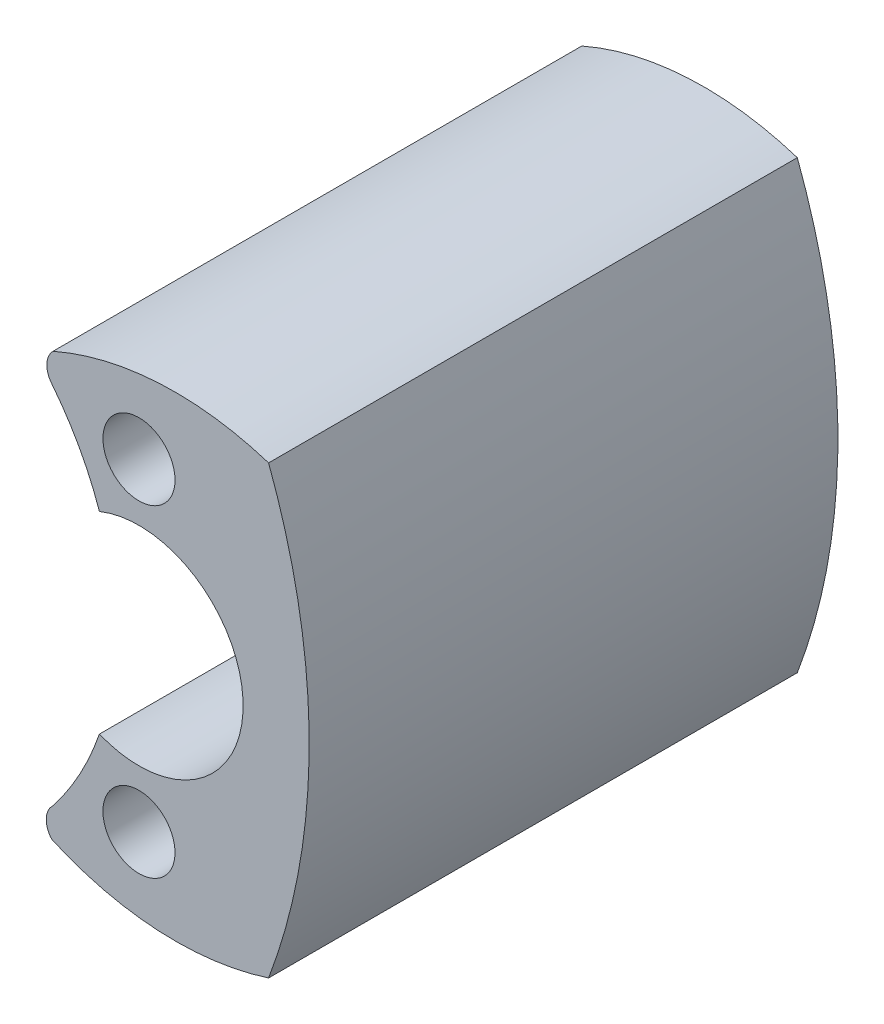
ISO-10303-21;
HEADER;
FILE_DESCRIPTION(('STEP AP214'),'2;1');
FILE_NAME('part.step','',(''),(''),'','','');
FILE_SCHEMA(('AUTOMOTIVE_DESIGN { 1 0 10303 214 1 1 1 1 }'));
ENDSEC;
DATA;
#1=APPLICATION_CONTEXT('core data for automotive mechanical design processes');
#2=APPLICATION_PROTOCOL_DEFINITION('international standard','automotive_design',2000,#1);
#3=PRODUCT_CONTEXT('',#1,'mechanical');
#4=PRODUCT('Part','Part','',(#3));
#5=PRODUCT_RELATED_PRODUCT_CATEGORY('part','',(#4));
#6=PRODUCT_DEFINITION_FORMATION('','',#4);
#7=PRODUCT_DEFINITION_CONTEXT('part definition',#1,'design');
#8=PRODUCT_DEFINITION('design','',#6,#7);
#9=PRODUCT_DEFINITION_SHAPE('','',#8);
#10=(LENGTH_UNIT() NAMED_UNIT(*) SI_UNIT(.MILLI.,.METRE.));
#11=(NAMED_UNIT(*) PLANE_ANGLE_UNIT() SI_UNIT($,.RADIAN.));
#12=(NAMED_UNIT(*) SI_UNIT($,.STERADIAN.) SOLID_ANGLE_UNIT());
#13=UNCERTAINTY_MEASURE_WITH_UNIT(LENGTH_MEASURE(1.E-05),#10,'distance_accuracy_value','');
#14=(GEOMETRIC_REPRESENTATION_CONTEXT(3) GLOBAL_UNCERTAINTY_ASSIGNED_CONTEXT((#13)) GLOBAL_UNIT_ASSIGNED_CONTEXT((#10,
#11,#12)) REPRESENTATION_CONTEXT('',''));
#15=CARTESIAN_POINT('',(0.,0.,0.));
#16=DIRECTION('',(0.,0.,1.));
#17=DIRECTION('',(1.,0.,0.));
#18=AXIS2_PLACEMENT_3D('',#15,#16,#17);
#19=CARTESIAN_POINT('',(-13.2313355478784,0.,22.));
#20=DIRECTION('',(0.,0.,-1.));
#21=DIRECTION('',(-1.,0.,0.));
#22=AXIS2_PLACEMENT_3D('',#19,#20,#21);
#23=CYLINDRICAL_SURFACE('',#22,12.2604861513936);
#24=CARTESIAN_POINT('',(-13.2313355478784,0.,22.));
#25=DIRECTION('',(0.,0.,-1.));
#26=DIRECTION('',(-1.,0.,0.));
#27=AXIS2_PLACEMENT_3D('',#24,#25,#26);
#28=CIRCLE('',#27,12.2604861513936);
#29=CARTESIAN_POINT('',(-1.64537225114125,-4.01060782864323,22.));
#30=VERTEX_POINT('',#29);
#31=CARTESIAN_POINT('',(-3.57576767996249,-7.55576136577806,22.));
#32=VERTEX_POINT('',#31);
#33=EDGE_CURVE('E125',#30,#32,#28,.T.);
#34=ORIENTED_EDGE('',*,*,#33,.F.);
#35=DIRECTION('',(0.,0.,-1.));
#36=VECTOR('',#35,1.);
#37=CARTESIAN_POINT('',(-1.64537225114125,-4.01060782864323,11.999));
#38=LINE('',#37,#36);
#39=CARTESIAN_POINT('',(-1.64537225114125,-4.01060782864323,-0.001));
#40=VERTEX_POINT('',#39);
#41=EDGE_CURVE('E112',#30,#40,#38,.T.);
#42=ORIENTED_EDGE('',*,*,#41,.T.);
#43=CARTESIAN_POINT('',(-13.2313355478784,0.,-0.001));
#44=DIRECTION('',(0.,0.,-1.));
#45=DIRECTION('',(-1.,0.,0.));
#46=AXIS2_PLACEMENT_3D('',#43,#44,#45);
#47=CIRCLE('',#46,12.2604861513936);
#48=CARTESIAN_POINT('',(-3.57576767996249,-7.55576136577806,-0.001));
#49=VERTEX_POINT('',#48);
#50=EDGE_CURVE('E123',#40,#49,#47,.T.);
#51=ORIENTED_EDGE('',*,*,#50,.T.);
#52=DIRECTION('',(0.,0.,-1.));
#53=VECTOR('',#52,1.);
#54=CARTESIAN_POINT('',(-3.57576767996249,-7.55576136577806,22.));
#55=LINE('',#54,#53);
#56=EDGE_CURVE('E167',#32,#49,#55,.T.);
#57=ORIENTED_EDGE('',*,*,#56,.F.);
#58=EDGE_LOOP('',(#34,#42,#51,#57));
#59=FACE_BOUND('',#58,.T.);
#60=ADVANCED_FACE('F47',(#59),#23,.F.);
#61=CARTESIAN_POINT('',(1.51645658150854,-2.74018411875687,22.));
#62=DIRECTION('',(0.,0.,-1.));
#63=DIRECTION('',(-1.,0.,0.));
#64=AXIS2_PLACEMENT_3D('',#61,#62,#63);
#65=CYLINDRICAL_SURFACE('',#64,12.6318125052895);
#66=DIRECTION('',(0.,0.,-1.));
#67=VECTOR('',#66,1.);
#68=CARTESIAN_POINT('',(5.39429470920508,9.28167341758802,22.));
#69=LINE('',#68,#67);
#70=CARTESIAN_POINT('',(5.39429470920508,9.28167341758802,22.));
#71=VERTEX_POINT('',#70);
#72=CARTESIAN_POINT('',(5.39429470920508,9.28167341758802,-0.001));
#73=VERTEX_POINT('',#72);
#74=EDGE_CURVE('E161',#71,#73,#69,.T.);
#75=ORIENTED_EDGE('',*,*,#74,.T.);
#76=CARTESIAN_POINT('',(1.51645658150854,-2.74018411875687,-0.001));
#77=DIRECTION('',(0.,0.,1.));
#78=DIRECTION('',(-1.,0.,0.));
#79=AXIS2_PLACEMENT_3D('',#76,#77,#78);
#80=CIRCLE('',#79,12.6318125052895);
#81=CARTESIAN_POINT('',(-3.57576767996249,8.81974404882597,-0.001));
#82=VERTEX_POINT('',#81);
#83=EDGE_CURVE('E138',#73,#82,#80,.T.);
#84=ORIENTED_EDGE('',*,*,#83,.T.);
#85=DIRECTION('',(0.,0.,-1.));
#86=VECTOR('',#85,1.);
#87=CARTESIAN_POINT('',(-3.57576767996249,8.81974404882597,22.));
#88=LINE('',#87,#86);
#89=CARTESIAN_POINT('',(-3.57576767996249,8.81974404882597,22.));
#90=VERTEX_POINT('',#89);
#91=EDGE_CURVE('E11',#90,#82,#88,.T.);
#92=ORIENTED_EDGE('',*,*,#91,.F.);
#93=CARTESIAN_POINT('',(1.51645658150854,-2.74018411875687,22.));
#94=DIRECTION('',(0.,0.,1.));
#95=DIRECTION('',(-1.,0.,0.));
#96=AXIS2_PLACEMENT_3D('',#93,#94,#95);
#97=CIRCLE('',#96,12.6318125052895);
#98=EDGE_CURVE('E149',#71,#90,#97,.T.);
#99=ORIENTED_EDGE('',*,*,#98,.F.);
#100=EDGE_LOOP('',(#75,#84,#92,#99));
#101=FACE_BOUND('',#100,.T.);
#102=ADVANCED_FACE('F49',(#101),#65,.T.);
#103=CARTESIAN_POINT('',(-2.93942531431104,8.19213389498871,22.));
#104=DIRECTION('',(0.,0.,-1.));
#105=DIRECTION('',(-1.,0.,0.));
#106=AXIS2_PLACEMENT_3D('',#103,#104,#105);
#107=CYLINDRICAL_SURFACE('',#106,0.893770726485547);
#108=ORIENTED_EDGE('',*,*,#91,.T.);
#109=CARTESIAN_POINT('',(-2.93942531431104,8.19213389498871,-0.001));
#110=DIRECTION('',(0.,0.,1.));
#111=DIRECTION('',(-1.,0.,0.));
#112=AXIS2_PLACEMENT_3D('',#109,#110,#111);
#113=CIRCLE('',#112,0.893770726485547);
#114=CARTESIAN_POINT('',(-3.63871286599695,7.63551640372596,-0.001));
#115=VERTEX_POINT('',#114);
#116=EDGE_CURVE('E135',#82,#115,#113,.T.);
#117=ORIENTED_EDGE('',*,*,#116,.T.);
#118=DIRECTION('',(0.,0.,-1.));
#119=VECTOR('',#118,1.);
#120=CARTESIAN_POINT('',(-3.63871286599695,7.63551640372596,22.));
#121=LINE('',#120,#119);
#122=CARTESIAN_POINT('',(-3.63871286599695,7.63551640372596,22.));
#123=VERTEX_POINT('',#122);
#124=EDGE_CURVE('E55',#123,#115,#121,.T.);
#125=ORIENTED_EDGE('',*,*,#124,.F.);
#126=CARTESIAN_POINT('',(-2.93942531431104,8.19213389498871,22.));
#127=DIRECTION('',(0.,0.,1.));
#128=DIRECTION('',(-1.,0.,0.));
#129=AXIS2_PLACEMENT_3D('',#126,#127,#128);
#130=CIRCLE('',#129,0.893770726485547);
#131=EDGE_CURVE('E151',#90,#123,#130,.T.);
#132=ORIENTED_EDGE('',*,*,#131,.F.);
#133=EDGE_LOOP('',(#108,#117,#125,#132));
#134=FACE_BOUND('',#133,.T.);
#135=ADVANCED_FACE('F176',(#134),#107,.T.);
#136=CARTESIAN_POINT('',(-1.64537225114125,4.01060782864323,-0.00100000000000088));
#137=VERTEX_POINT('',#136);
#138=EDGE_CURVE('E134',#115,#137,#47,.T.);
#139=ORIENTED_EDGE('',*,*,#138,.T.);
#140=DIRECTION('',(0.,0.,-1.));
#141=VECTOR('',#140,1.);
#142=CARTESIAN_POINT('',(-1.64537225114125,4.01060782864323,11.999));
#143=LINE('',#142,#141);
#144=CARTESIAN_POINT('',(-1.64537225114125,4.01060782864323,22.));
#145=VERTEX_POINT('',#144);
#146=EDGE_CURVE('E62',#137,#145,#143,.F.);
#147=ORIENTED_EDGE('',*,*,#146,.T.);
#148=EDGE_CURVE('E153',#123,#145,#28,.T.);
#149=ORIENTED_EDGE('',*,*,#148,.F.);
#150=ORIENTED_EDGE('',*,*,#124,.T.);
#151=EDGE_LOOP('',(#139,#147,#149,#150));
#152=FACE_BOUND('',#151,.T.);
#153=ADVANCED_FACE('F171',(#152),#23,.F.);
#154=CARTESIAN_POINT('',(-2.97974763085371,-8.20163469798779,22.));
#155=DIRECTION('',(0.,0.,-1.));
#156=DIRECTION('',(-1.,0.,0.));
#157=AXIS2_PLACEMENT_3D('',#154,#155,#156);
#158=CYLINDRICAL_SURFACE('',#157,0.878858498393984);
#159=ORIENTED_EDGE('',*,*,#56,.T.);
#160=CARTESIAN_POINT('',(-2.97974763085371,-8.20163469798779,-0.001));
#161=DIRECTION('',(0.,0.,1.));
#162=DIRECTION('',(1.,0.,0.));
#163=AXIS2_PLACEMENT_3D('',#160,#161,#162);
#164=CIRCLE('',#163,0.878858498393984);
#165=CARTESIAN_POINT('',(-3.62562096306344,-8.79765474709655,-0.001));
#166=VERTEX_POINT('',#165);
#167=EDGE_CURVE('E133',#49,#166,#164,.T.);
#168=ORIENTED_EDGE('',*,*,#167,.T.);
#169=DIRECTION('',(0.,0.,-1.));
#170=VECTOR('',#169,1.);
#171=CARTESIAN_POINT('',(-3.62562096306344,-8.79765474709655,22.));
#172=LINE('',#171,#170);
#173=CARTESIAN_POINT('',(-3.62562096306344,-8.79765474709655,22.));
#174=VERTEX_POINT('',#173);
#175=EDGE_CURVE('E165',#174,#166,#172,.T.);
#176=ORIENTED_EDGE('',*,*,#175,.F.);
#177=CARTESIAN_POINT('',(-2.97974763085371,-8.20163469798779,22.));
#178=DIRECTION('',(0.,0.,1.));
#179=DIRECTION('',(1.,0.,0.));
#180=AXIS2_PLACEMENT_3D('',#177,#178,#179);
#181=CIRCLE('',#180,0.878858498393984);
#182=EDGE_CURVE('E156',#32,#174,#181,.T.);
#183=ORIENTED_EDGE('',*,*,#182,.F.);
#184=EDGE_LOOP('',(#159,#168,#176,#183));
#185=FACE_BOUND('',#184,.T.);
#186=ADVANCED_FACE('F198',(#185),#158,.T.);
#187=CARTESIAN_POINT('',(1.51645658150854,2.74018411875671,22.));
#188=DIRECTION('',(0.,0.,-1.));
#189=DIRECTION('',(-1.,0.,0.));
#190=AXIS2_PLACEMENT_3D('',#187,#188,#189);
#191=CYLINDRICAL_SURFACE('',#190,12.6318125052894);
#192=ORIENTED_EDGE('',*,*,#175,.T.);
#193=CARTESIAN_POINT('',(1.51645658150854,2.74018411875671,-0.001));
#194=DIRECTION('',(0.,0.,1.));
#195=DIRECTION('',(1.,0.,0.));
#196=AXIS2_PLACEMENT_3D('',#193,#194,#195);
#197=CIRCLE('',#196,12.6318125052894);
#198=CARTESIAN_POINT('',(5.39429470920509,-9.28167341758802,-0.001));
#199=VERTEX_POINT('',#198);
#200=EDGE_CURVE('E143',#166,#199,#197,.T.);
#201=ORIENTED_EDGE('',*,*,#200,.T.);
#202=DIRECTION('',(0.,0.,-1.));
#203=VECTOR('',#202,1.);
#204=CARTESIAN_POINT('',(5.39429470920509,-9.28167341758802,22.));
#205=LINE('',#204,#203);
#206=CARTESIAN_POINT('',(5.39429470920509,-9.28167341758802,22.));
#207=VERTEX_POINT('',#206);
#208=EDGE_CURVE('E163',#207,#199,#205,.T.);
#209=ORIENTED_EDGE('',*,*,#208,.F.);
#210=CARTESIAN_POINT('',(1.51645658150854,2.74018411875671,22.));
#211=DIRECTION('',(0.,0.,1.));
#212=DIRECTION('',(1.,0.,0.));
#213=AXIS2_PLACEMENT_3D('',#210,#211,#212);
#214=CIRCLE('',#213,12.6318125052894);
#215=EDGE_CURVE('E158',#174,#207,#214,.T.);
#216=ORIENTED_EDGE('',*,*,#215,.F.);
#217=EDGE_LOOP('',(#192,#201,#209,#216));
#218=FACE_BOUND('',#217,.T.);
#219=ADVANCED_FACE('F202',(#218),#191,.T.);
#220=CARTESIAN_POINT('',(-19.2656664170293,0.,22.));
#221=DIRECTION('',(0.,0.,-1.));
#222=DIRECTION('',(-1.,0.,0.));
#223=AXIS2_PLACEMENT_3D('',#220,#221,#222);
#224=CYLINDRICAL_SURFACE('',#223,26.3488736794981);
#225=ORIENTED_EDGE('',*,*,#208,.T.);
#226=CARTESIAN_POINT('',(-19.2656664170293,0.,-0.001));
#227=DIRECTION('',(0.,0.,1.));
#228=DIRECTION('',(-1.,0.,0.));
#229=AXIS2_PLACEMENT_3D('',#226,#227,#228);
#230=CIRCLE('',#229,26.3488736794981);
#231=EDGE_CURVE('E146',#199,#73,#230,.T.);
#232=ORIENTED_EDGE('',*,*,#231,.T.);
#233=ORIENTED_EDGE('',*,*,#74,.F.);
#234=CARTESIAN_POINT('',(-19.2656664170293,0.,22.));
#235=DIRECTION('',(0.,0.,1.));
#236=DIRECTION('',(-1.,0.,0.));
#237=AXIS2_PLACEMENT_3D('',#234,#235,#236);
#238=CIRCLE('',#237,26.3488736794981);
#239=EDGE_CURVE('E70',#207,#71,#238,.T.);
#240=ORIENTED_EDGE('',*,*,#239,.F.);
#241=EDGE_LOOP('',(#225,#232,#233,#240));
#242=FACE_BOUND('',#241,.T.);
#243=ADVANCED_FACE('F204',(#242),#224,.T.);
#244=CARTESIAN_POINT('',(-8.87460491776037,-1.37009205937844,22.));
#245=DIRECTION('',(0.,0.,-1.));
#246=DIRECTION('',(-1.,0.,0.));
#247=AXIS2_PLACEMENT_3D('',#244,#245,#246);
#248=PLANE('',#247);
#249=CARTESIAN_POINT('',(0.,-6.715,22.));
#250=DIRECTION('',(0.,0.,1.));
#251=DIRECTION('',(-1.,0.,0.));
#252=AXIS2_PLACEMENT_3D('',#249,#250,#251);
#253=CIRCLE('',#252,1.5);
#254=CARTESIAN_POINT('',(-1.5,-6.715,22.));
#255=VERTEX_POINT('',#254);
#256=EDGE_CURVE('E126',#255,#255,#253,.T.);
#257=ORIENTED_EDGE('',*,*,#256,.F.);
#258=EDGE_LOOP('',(#257));
#259=FACE_BOUND('',#258,.T.);
#260=CARTESIAN_POINT('',(0.,6.715,22.));
#261=DIRECTION('',(0.,0.,1.));
#262=DIRECTION('',(1.,0.,0.));
#263=AXIS2_PLACEMENT_3D('',#260,#261,#262);
#264=CIRCLE('',#263,1.5);
#265=CARTESIAN_POINT('',(1.5,6.715,22.));
#266=VERTEX_POINT('',#265);
#267=EDGE_CURVE('E183',#266,#266,#264,.T.);
#268=ORIENTED_EDGE('',*,*,#267,.F.);
#269=EDGE_LOOP('',(#268));
#270=FACE_BOUND('',#269,.T.);
#271=ORIENTED_EDGE('',*,*,#148,.T.);
#272=CARTESIAN_POINT('',(0.,0.,22.));
#273=DIRECTION('',(0.,0.,-1.));
#274=DIRECTION('',(-1.,0.,0.));
#275=AXIS2_PLACEMENT_3D('',#272,#273,#274);
#276=CIRCLE('',#275,4.335);
#277=EDGE_CURVE('E118',#145,#30,#276,.T.);
#278=ORIENTED_EDGE('',*,*,#277,.T.);
#279=ORIENTED_EDGE('',*,*,#33,.T.);
#280=ORIENTED_EDGE('',*,*,#182,.T.);
#281=ORIENTED_EDGE('',*,*,#215,.T.);
#282=ORIENTED_EDGE('',*,*,#239,.T.);
#283=ORIENTED_EDGE('',*,*,#98,.T.);
#284=ORIENTED_EDGE('',*,*,#131,.T.);
#285=EDGE_LOOP('',(#271,#278,#279,#280,#281,#282,#283,#284));
#286=FACE_BOUND('',#285,.T.);
#287=ADVANCED_FACE('F194',(#259,#270,#286),#248,.F.);
#288=CARTESIAN_POINT('',(-8.87460491776037,-1.37009205937844,-0.001));
#289=DIRECTION('',(0.,0.,-1.));
#290=DIRECTION('',(-1.,0.,0.));
#291=AXIS2_PLACEMENT_3D('',#288,#289,#290);
#292=PLANE('',#291);
#293=CARTESIAN_POINT('',(0.,0.,-0.001));
#294=DIRECTION('',(0.,0.,-1.));
#295=DIRECTION('',(-1.,0.,0.));
#296=AXIS2_PLACEMENT_3D('',#293,#294,#295);
#297=CIRCLE('',#296,4.335);
#298=EDGE_CURVE('E109',#137,#40,#297,.T.);
#299=ORIENTED_EDGE('',*,*,#298,.F.);
#300=ORIENTED_EDGE('',*,*,#138,.F.);
#301=ORIENTED_EDGE('',*,*,#116,.F.);
#302=ORIENTED_EDGE('',*,*,#83,.F.);
#303=ORIENTED_EDGE('',*,*,#231,.F.);
#304=ORIENTED_EDGE('',*,*,#200,.F.);
#305=ORIENTED_EDGE('',*,*,#167,.F.);
#306=ORIENTED_EDGE('',*,*,#50,.F.);
#307=EDGE_LOOP('',(#299,#300,#301,#302,#303,#304,#305,#306));
#308=FACE_BOUND('',#307,.T.);
#309=CARTESIAN_POINT('',(0.,-6.715,-0.001000000000001));
#310=DIRECTION('',(0.,0.,1.));
#311=DIRECTION('',(-1.,0.,0.));
#312=AXIS2_PLACEMENT_3D('',#309,#310,#311);
#313=CIRCLE('',#312,1.5);
#314=CARTESIAN_POINT('',(-1.5,-6.715,-0.001000000000001));
#315=VERTEX_POINT('',#314);
#316=EDGE_CURVE('E187',#315,#315,#313,.T.);
#317=ORIENTED_EDGE('',*,*,#316,.T.);
#318=EDGE_LOOP('',(#317));
#319=FACE_BOUND('',#318,.T.);
#320=CARTESIAN_POINT('',(0.,6.715,-0.001000000000001));
#321=DIRECTION('',(0.,0.,1.));
#322=DIRECTION('',(1.,0.,0.));
#323=AXIS2_PLACEMENT_3D('',#320,#321,#322);
#324=CIRCLE('',#323,1.5);
#325=CARTESIAN_POINT('',(1.5,6.715,-0.001000000000001));
#326=VERTEX_POINT('',#325);
#327=EDGE_CURVE('E181',#326,#326,#324,.T.);
#328=ORIENTED_EDGE('',*,*,#327,.T.);
#329=EDGE_LOOP('',(#328));
#330=FACE_BOUND('',#329,.T.);
#331=ADVANCED_FACE('F129',(#308,#319,#330),#292,.T.);
#332=CARTESIAN_POINT('',(0.,6.715,-0.001000000000001));
#333=DIRECTION('',(0.,0.,1.));
#334=DIRECTION('',(1.,0.,0.));
#335=AXIS2_PLACEMENT_3D('',#332,#333,#334);
#336=CYLINDRICAL_SURFACE('',#335,1.5);
#337=ORIENTED_EDGE('',*,*,#327,.F.);
#338=EDGE_LOOP('',(#337));
#339=FACE_BOUND('',#338,.T.);
#340=ORIENTED_EDGE('',*,*,#267,.T.);
#341=EDGE_LOOP('',(#340));
#342=FACE_BOUND('',#341,.T.);
#343=ADVANCED_FACE('F275',(#339,#342),#336,.F.);
#344=CARTESIAN_POINT('',(0.,-6.715,-0.001000000000001));
#345=DIRECTION('',(0.,0.,1.));
#346=DIRECTION('',(1.,0.,0.));
#347=AXIS2_PLACEMENT_3D('',#344,#345,#346);
#348=CYLINDRICAL_SURFACE('',#347,1.5);
#349=ORIENTED_EDGE('',*,*,#316,.F.);
#350=EDGE_LOOP('',(#349));
#351=FACE_BOUND('',#350,.T.);
#352=ORIENTED_EDGE('',*,*,#256,.T.);
#353=EDGE_LOOP('',(#352));
#354=FACE_BOUND('',#353,.T.);
#355=ADVANCED_FACE('F245',(#351,#354),#348,.F.);
#356=CARTESIAN_POINT('',(0.,0.,23.999));
#357=DIRECTION('',(0.,0.,-1.));
#358=DIRECTION('',(-1.,0.,0.));
#359=AXIS2_PLACEMENT_3D('',#356,#357,#358);
#360=CYLINDRICAL_SURFACE('',#359,4.335);
#361=ORIENTED_EDGE('',*,*,#277,.F.);
#362=ORIENTED_EDGE('',*,*,#146,.F.);
#363=ORIENTED_EDGE('',*,*,#298,.T.);
#364=ORIENTED_EDGE('',*,*,#41,.F.);
#365=EDGE_LOOP('',(#361,#362,#363,#364));
#366=FACE_BOUND('',#365,.T.);
#367=ADVANCED_FACE('F111',(#366),#360,.F.);
#368=CLOSED_SHELL('',(#60,#102,#135,#153,#186,#219,#243,#287,#331,#343,#355,#367));
#369=MANIFOLD_SOLID_BREP('B2',#368);
#370=ADVANCED_BREP_SHAPE_REPRESENTATION('',(#18,#369),#14);
#371=SHAPE_DEFINITION_REPRESENTATION(#9,#370);
ENDSEC;
END-ISO-10303-21;
